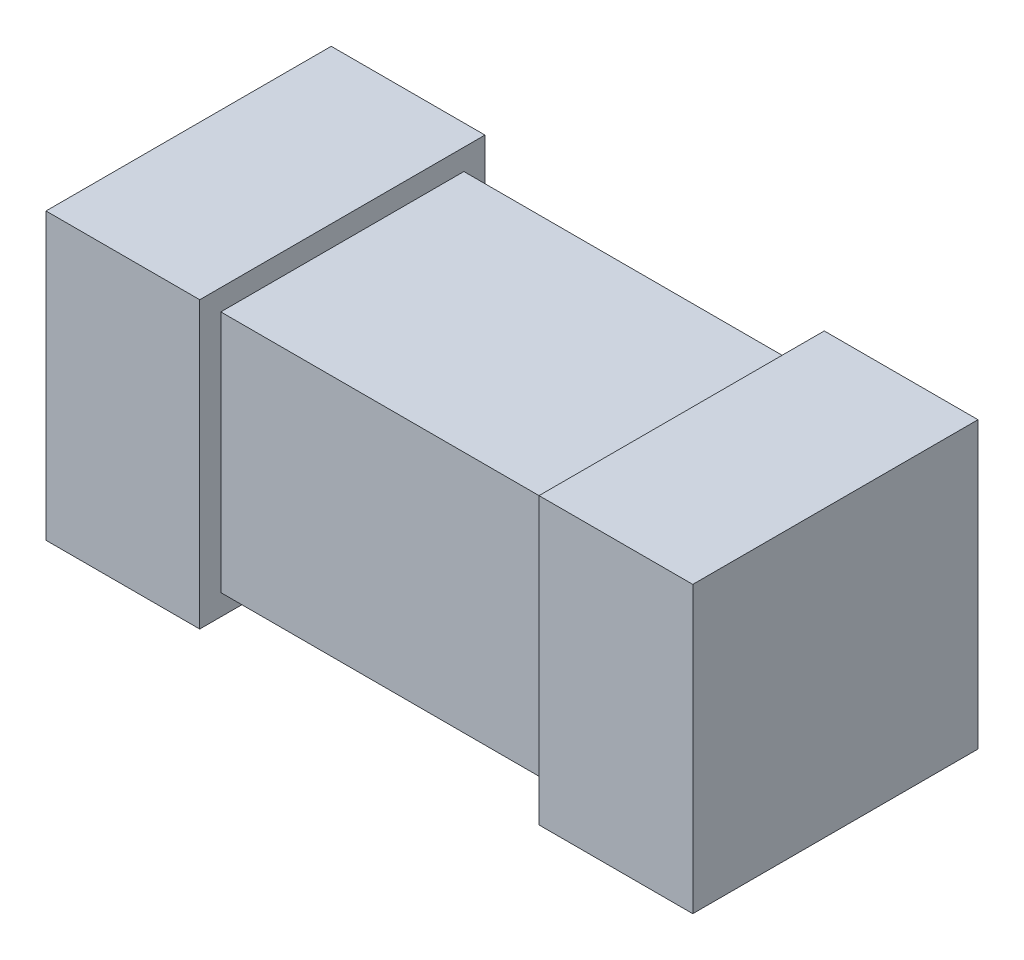
ISO-10303-21;
HEADER;
FILE_DESCRIPTION(('STEP AP214'),'2;1');
FILE_NAME('part.step','',(''),(''),'','','');
FILE_SCHEMA(('AUTOMOTIVE_DESIGN { 1 0 10303 214 1 1 1 1 }'));
ENDSEC;
DATA;
#1=APPLICATION_CONTEXT('core data for automotive mechanical design processes');
#2=APPLICATION_PROTOCOL_DEFINITION('international standard','automotive_design',2000,#1);
#3=PRODUCT_CONTEXT('',#1,'mechanical');
#4=PRODUCT('Part','Part','',(#3));
#5=PRODUCT_RELATED_PRODUCT_CATEGORY('part','',(#4));
#6=PRODUCT_DEFINITION_FORMATION('','',#4);
#7=PRODUCT_DEFINITION_CONTEXT('part definition',#1,'design');
#8=PRODUCT_DEFINITION('design','',#6,#7);
#9=PRODUCT_DEFINITION_SHAPE('','',#8);
#10=(LENGTH_UNIT() NAMED_UNIT(*) SI_UNIT(.MILLI.,.METRE.));
#11=(NAMED_UNIT(*) PLANE_ANGLE_UNIT() SI_UNIT($,.RADIAN.));
#12=(NAMED_UNIT(*) SI_UNIT($,.STERADIAN.) SOLID_ANGLE_UNIT());
#13=UNCERTAINTY_MEASURE_WITH_UNIT(LENGTH_MEASURE(1.E-05),#10,'distance_accuracy_value','');
#14=(GEOMETRIC_REPRESENTATION_CONTEXT(3) GLOBAL_UNCERTAINTY_ASSIGNED_CONTEXT((#13)) GLOBAL_UNIT_ASSIGNED_CONTEXT((#10,
#11,#12)) REPRESENTATION_CONTEXT('',''));
#15=CARTESIAN_POINT('',(0.,0.,0.));
#16=DIRECTION('',(0.,0.,1.));
#17=DIRECTION('',(1.,0.,0.));
#18=AXIS2_PLACEMENT_3D('',#15,#16,#17);
#19=CARTESIAN_POINT('',(1.6,-1.345,2.69));
#20=DIRECTION('',(1.,0.,0.));
#21=DIRECTION('',(0.,0.,-1.));
#22=AXIS2_PLACEMENT_3D('',#19,#20,#21);
#23=PLANE('',#22);
#24=DIRECTION('',(0.,-1.,0.));
#25=VECTOR('',#24,1.);
#26=CARTESIAN_POINT('',(1.6,-1.345,0.));
#27=LINE('',#26,#25);
#28=CARTESIAN_POINT('',(1.6,1.345,0.));
#29=VERTEX_POINT('',#28);
#30=CARTESIAN_POINT('',(1.6,-1.345,0.));
#31=VERTEX_POINT('',#30);
#32=EDGE_CURVE('E211',#29,#31,#27,.T.);
#33=ORIENTED_EDGE('',*,*,#32,.T.);
#34=DIRECTION('',(0.,0.,-1.));
#35=VECTOR('',#34,1.);
#36=CARTESIAN_POINT('',(1.6,-1.345,2.69));
#37=LINE('',#36,#35);
#38=CARTESIAN_POINT('',(1.6,-1.345,2.69));
#39=VERTEX_POINT('',#38);
#40=EDGE_CURVE('E216',#39,#31,#37,.T.);
#41=ORIENTED_EDGE('',*,*,#40,.F.);
#42=DIRECTION('',(0.,-1.,0.));
#43=VECTOR('',#42,1.);
#44=CARTESIAN_POINT('',(1.6,-1.345,2.69));
#45=LINE('',#44,#43);
#46=CARTESIAN_POINT('',(1.6,1.345,2.69));
#47=VERTEX_POINT('',#46);
#48=EDGE_CURVE('E202',#47,#39,#45,.T.);
#49=ORIENTED_EDGE('',*,*,#48,.F.);
#50=DIRECTION('',(0.,0.,-1.));
#51=VECTOR('',#50,1.);
#52=CARTESIAN_POINT('',(1.6,1.345,2.69));
#53=LINE('',#52,#51);
#54=EDGE_CURVE('E45',#47,#29,#53,.T.);
#55=ORIENTED_EDGE('',*,*,#54,.T.);
#56=EDGE_LOOP('',(#33,#41,#49,#55));
#57=FACE_BOUND('',#56,.T.);
#58=DIRECTION('',(0.,1.,0.));
#59=VECTOR('',#58,1.);
#60=CARTESIAN_POINT('',(1.6,-1.14630192607053,2.49130192607053));
#61=LINE('',#60,#59);
#62=CARTESIAN_POINT('',(1.6,-1.14630192607053,2.49130192607053));
#63=VERTEX_POINT('',#62);
#64=CARTESIAN_POINT('',(1.6,1.14630192607053,2.49130192607053));
#65=VERTEX_POINT('',#64);
#66=EDGE_CURVE('E52',#63,#65,#61,.T.);
#67=ORIENTED_EDGE('',*,*,#66,.F.);
#68=DIRECTION('',(0.,0.,1.));
#69=VECTOR('',#68,1.);
#70=CARTESIAN_POINT('',(1.6,-1.14630192607053,0.198698073929466));
#71=LINE('',#70,#69);
#72=CARTESIAN_POINT('',(1.6,-1.14630192607053,0.198698073929466));
#73=VERTEX_POINT('',#72);
#74=EDGE_CURVE('E57',#73,#63,#71,.T.);
#75=ORIENTED_EDGE('',*,*,#74,.F.);
#76=DIRECTION('',(0.,-1.,0.));
#77=VECTOR('',#76,1.);
#78=CARTESIAN_POINT('',(1.6,-1.14630192607053,0.198698073929466));
#79=LINE('',#78,#77);
#80=CARTESIAN_POINT('',(1.6,1.14630192607053,0.198698073929466));
#81=VERTEX_POINT('',#80);
#82=EDGE_CURVE('E188',#81,#73,#79,.T.);
#83=ORIENTED_EDGE('',*,*,#82,.F.);
#84=DIRECTION('',(0.,0.,-1.));
#85=VECTOR('',#84,1.);
#86=CARTESIAN_POINT('',(1.6,1.14630192607053,0.198698073929466));
#87=LINE('',#86,#85);
#88=EDGE_CURVE('E133',#65,#81,#87,.T.);
#89=ORIENTED_EDGE('',*,*,#88,.F.);
#90=EDGE_LOOP('',(#67,#75,#83,#89));
#91=FACE_BOUND('',#90,.T.);
#92=ADVANCED_FACE('F37',(#57,#91),#23,.F.);
#93=CARTESIAN_POINT('',(3.05,-1.345,2.69));
#94=DIRECTION('',(-1.,0.,0.));
#95=DIRECTION('',(0.,0.,1.));
#96=AXIS2_PLACEMENT_3D('',#93,#94,#95);
#97=PLANE('',#96);
#98=DIRECTION('',(0.,1.,0.));
#99=VECTOR('',#98,1.);
#100=CARTESIAN_POINT('',(3.05,-1.345,0.));
#101=LINE('',#100,#99);
#102=CARTESIAN_POINT('',(3.05,-1.345,0.));
#103=VERTEX_POINT('',#102);
#104=CARTESIAN_POINT('',(3.05,1.345,0.));
#105=VERTEX_POINT('',#104);
#106=EDGE_CURVE('E195',#103,#105,#101,.T.);
#107=ORIENTED_EDGE('',*,*,#106,.T.);
#108=DIRECTION('',(0.,0.,-1.));
#109=VECTOR('',#108,1.);
#110=CARTESIAN_POINT('',(3.05,1.345,2.69));
#111=LINE('',#110,#109);
#112=CARTESIAN_POINT('',(3.05,1.345,2.69));
#113=VERTEX_POINT('',#112);
#114=EDGE_CURVE('E11',#113,#105,#111,.T.);
#115=ORIENTED_EDGE('',*,*,#114,.F.);
#116=DIRECTION('',(0.,1.,0.));
#117=VECTOR('',#116,1.);
#118=CARTESIAN_POINT('',(3.05,-1.345,2.69));
#119=LINE('',#118,#117);
#120=CARTESIAN_POINT('',(3.05,-1.345,2.69));
#121=VERTEX_POINT('',#120);
#122=EDGE_CURVE('E196',#121,#113,#119,.T.);
#123=ORIENTED_EDGE('',*,*,#122,.F.);
#124=DIRECTION('',(0.,0.,-1.));
#125=VECTOR('',#124,1.);
#126=CARTESIAN_POINT('',(3.05,-1.345,2.69));
#127=LINE('',#126,#125);
#128=EDGE_CURVE('E206',#121,#103,#127,.T.);
#129=ORIENTED_EDGE('',*,*,#128,.T.);
#130=EDGE_LOOP('',(#107,#115,#123,#129));
#131=FACE_BOUND('',#130,.T.);
#132=ADVANCED_FACE('F39',(#131),#97,.F.);
#133=CARTESIAN_POINT('',(1.6,1.345,2.69));
#134=DIRECTION('',(0.,-1.,0.));
#135=DIRECTION('',(0.,0.,-1.));
#136=AXIS2_PLACEMENT_3D('',#133,#134,#135);
#137=PLANE('',#136);
#138=DIRECTION('',(-1.,0.,0.));
#139=VECTOR('',#138,1.);
#140=CARTESIAN_POINT('',(1.6,1.345,0.));
#141=LINE('',#140,#139);
#142=EDGE_CURVE('E209',#105,#29,#141,.T.);
#143=ORIENTED_EDGE('',*,*,#142,.T.);
#144=ORIENTED_EDGE('',*,*,#54,.F.);
#145=DIRECTION('',(-1.,0.,0.));
#146=VECTOR('',#145,1.);
#147=CARTESIAN_POINT('',(1.6,1.345,2.69));
#148=LINE('',#147,#146);
#149=EDGE_CURVE('E199',#113,#47,#148,.T.);
#150=ORIENTED_EDGE('',*,*,#149,.F.);
#151=ORIENTED_EDGE('',*,*,#114,.T.);
#152=EDGE_LOOP('',(#143,#144,#150,#151));
#153=FACE_BOUND('',#152,.T.);
#154=ADVANCED_FACE('F238',(#153),#137,.F.);
#155=CARTESIAN_POINT('',(1.6,-1.345,2.69));
#156=DIRECTION('',(0.,1.,0.));
#157=DIRECTION('',(0.,0.,1.));
#158=AXIS2_PLACEMENT_3D('',#155,#156,#157);
#159=PLANE('',#158);
#160=DIRECTION('',(1.,0.,0.));
#161=VECTOR('',#160,1.);
#162=CARTESIAN_POINT('',(1.6,-1.345,0.));
#163=LINE('',#162,#161);
#164=EDGE_CURVE('E200',#31,#103,#163,.T.);
#165=ORIENTED_EDGE('',*,*,#164,.T.);
#166=ORIENTED_EDGE('',*,*,#128,.F.);
#167=DIRECTION('',(1.,0.,0.));
#168=VECTOR('',#167,1.);
#169=CARTESIAN_POINT('',(1.6,-1.345,2.69));
#170=LINE('',#169,#168);
#171=EDGE_CURVE('E204',#39,#121,#170,.T.);
#172=ORIENTED_EDGE('',*,*,#171,.F.);
#173=ORIENTED_EDGE('',*,*,#40,.T.);
#174=EDGE_LOOP('',(#165,#166,#172,#173));
#175=FACE_BOUND('',#174,.T.);
#176=ADVANCED_FACE('F231',(#175),#159,.F.);
#177=CARTESIAN_POINT('',(0.,0.,2.69));
#178=DIRECTION('',(0.,0.,-1.));
#179=DIRECTION('',(-1.,0.,0.));
#180=AXIS2_PLACEMENT_3D('',#177,#178,#179);
#181=PLANE('',#180);
#182=ORIENTED_EDGE('',*,*,#122,.T.);
#183=ORIENTED_EDGE('',*,*,#149,.T.);
#184=ORIENTED_EDGE('',*,*,#48,.T.);
#185=ORIENTED_EDGE('',*,*,#171,.T.);
#186=EDGE_LOOP('',(#182,#183,#184,#185));
#187=FACE_BOUND('',#186,.T.);
#188=ADVANCED_FACE('F237',(#187),#181,.F.);
#189=CARTESIAN_POINT('',(0.,0.,0.));
#190=DIRECTION('',(0.,0.,-1.));
#191=DIRECTION('',(-1.,0.,0.));
#192=AXIS2_PLACEMENT_3D('',#189,#190,#191);
#193=PLANE('',#192);
#194=ORIENTED_EDGE('',*,*,#106,.F.);
#195=ORIENTED_EDGE('',*,*,#164,.F.);
#196=ORIENTED_EDGE('',*,*,#32,.F.);
#197=ORIENTED_EDGE('',*,*,#142,.F.);
#198=EDGE_LOOP('',(#194,#195,#196,#197));
#199=FACE_BOUND('',#198,.T.);
#200=ADVANCED_FACE('F228',(#199),#193,.T.);
#201=CARTESIAN_POINT('',(-3.2422314608467,-1.14630192607053,0.198698073929466));
#202=DIRECTION('',(0.,1.,0.));
#203=DIRECTION('',(0.,0.,1.));
#204=AXIS2_PLACEMENT_3D('',#201,#202,#203);
#205=PLANE('',#204);
#206=DIRECTION('',(1.,0.,0.));
#207=VECTOR('',#206,1.);
#208=CARTESIAN_POINT('',(-3.2422314608467,-1.14630192607053,2.49130192607053));
#209=LINE('',#208,#207);
#210=CARTESIAN_POINT('',(-1.6,-1.14630192607053,2.49130192607053));
#211=VERTEX_POINT('',#210);
#212=EDGE_CURVE('E191',#211,#63,#209,.T.);
#213=ORIENTED_EDGE('',*,*,#212,.F.);
#214=DIRECTION('',(0.,0.,1.));
#215=VECTOR('',#214,1.);
#216=CARTESIAN_POINT('',(-1.6,-1.14630192607053,0.198698073929466));
#217=LINE('',#216,#215);
#218=CARTESIAN_POINT('',(-1.6,-1.14630192607053,0.198698073929466));
#219=VERTEX_POINT('',#218);
#220=EDGE_CURVE('E145',#219,#211,#217,.T.);
#221=ORIENTED_EDGE('',*,*,#220,.F.);
#222=DIRECTION('',(1.,0.,0.));
#223=VECTOR('',#222,1.);
#224=CARTESIAN_POINT('',(-3.2422314608467,-1.14630192607053,0.198698073929466));
#225=LINE('',#224,#223);
#226=EDGE_CURVE('E137',#219,#73,#225,.T.);
#227=ORIENTED_EDGE('',*,*,#226,.T.);
#228=ORIENTED_EDGE('',*,*,#74,.T.);
#229=EDGE_LOOP('',(#213,#221,#227,#228));
#230=FACE_BOUND('',#229,.T.);
#231=ADVANCED_FACE('F252',(#230),#205,.F.);
#232=CARTESIAN_POINT('',(-3.2422314608467,-1.14630192607053,0.198698073929466));
#233=DIRECTION('',(0.,0.,1.));
#234=DIRECTION('',(1.,0.,0.));
#235=AXIS2_PLACEMENT_3D('',#232,#233,#234);
#236=PLANE('',#235);
#237=ORIENTED_EDGE('',*,*,#226,.F.);
#238=DIRECTION('',(0.,-1.,0.));
#239=VECTOR('',#238,1.);
#240=CARTESIAN_POINT('',(-1.6,-1.14630192607053,0.198698073929466));
#241=LINE('',#240,#239);
#242=CARTESIAN_POINT('',(-1.6,1.14630192607053,0.198698073929466));
#243=VERTEX_POINT('',#242);
#244=EDGE_CURVE('E140',#243,#219,#241,.T.);
#245=ORIENTED_EDGE('',*,*,#244,.F.);
#246=DIRECTION('',(1.,0.,0.));
#247=VECTOR('',#246,1.);
#248=CARTESIAN_POINT('',(-3.2422314608467,1.14630192607053,0.198698073929466));
#249=LINE('',#248,#247);
#250=EDGE_CURVE('E126',#243,#81,#249,.T.);
#251=ORIENTED_EDGE('',*,*,#250,.T.);
#252=ORIENTED_EDGE('',*,*,#82,.T.);
#253=EDGE_LOOP('',(#237,#245,#251,#252));
#254=FACE_BOUND('',#253,.T.);
#255=ADVANCED_FACE('F141',(#254),#236,.F.);
#256=CARTESIAN_POINT('',(-3.2422314608467,1.14630192607053,0.198698073929466));
#257=DIRECTION('',(0.,-1.,0.));
#258=DIRECTION('',(0.,0.,-1.));
#259=AXIS2_PLACEMENT_3D('',#256,#257,#258);
#260=PLANE('',#259);
#261=ORIENTED_EDGE('',*,*,#250,.F.);
#262=DIRECTION('',(0.,0.,-1.));
#263=VECTOR('',#262,1.);
#264=CARTESIAN_POINT('',(-1.6,1.14630192607053,0.198698073929466));
#265=LINE('',#264,#263);
#266=CARTESIAN_POINT('',(-1.6,1.14630192607053,2.49130192607053));
#267=VERTEX_POINT('',#266);
#268=EDGE_CURVE('E131',#267,#243,#265,.T.);
#269=ORIENTED_EDGE('',*,*,#268,.F.);
#270=DIRECTION('',(1.,0.,0.));
#271=VECTOR('',#270,1.);
#272=CARTESIAN_POINT('',(-3.2422314608467,1.14630192607053,2.49130192607053));
#273=LINE('',#272,#271);
#274=EDGE_CURVE('E136',#267,#65,#273,.T.);
#275=ORIENTED_EDGE('',*,*,#274,.T.);
#276=ORIENTED_EDGE('',*,*,#88,.T.);
#277=EDGE_LOOP('',(#261,#269,#275,#276));
#278=FACE_BOUND('',#277,.T.);
#279=ADVANCED_FACE('F128',(#278),#260,.F.);
#280=CARTESIAN_POINT('',(-3.2422314608467,-1.14630192607053,2.49130192607053));
#281=DIRECTION('',(0.,0.,-1.));
#282=DIRECTION('',(-1.,0.,0.));
#283=AXIS2_PLACEMENT_3D('',#280,#281,#282);
#284=PLANE('',#283);
#285=ORIENTED_EDGE('',*,*,#274,.F.);
#286=DIRECTION('',(0.,1.,0.));
#287=VECTOR('',#286,1.);
#288=CARTESIAN_POINT('',(-1.6,-1.14630192607053,2.49130192607053));
#289=LINE('',#288,#287);
#290=EDGE_CURVE('E149',#211,#267,#289,.T.);
#291=ORIENTED_EDGE('',*,*,#290,.F.);
#292=ORIENTED_EDGE('',*,*,#212,.T.);
#293=ORIENTED_EDGE('',*,*,#66,.T.);
#294=EDGE_LOOP('',(#285,#291,#292,#293));
#295=FACE_BOUND('',#294,.T.);
#296=ADVANCED_FACE('F255',(#295),#284,.F.);
#297=CARTESIAN_POINT('',(-1.6,-1.345,2.69));
#298=DIRECTION('',(-1.,0.,0.));
#299=DIRECTION('',(0.,0.,-1.));
#300=AXIS2_PLACEMENT_3D('',#297,#298,#299);
#301=PLANE('',#300);
#302=DIRECTION('',(0.,-1.,0.));
#303=VECTOR('',#302,1.);
#304=CARTESIAN_POINT('',(-1.6,-1.345,0.));
#305=LINE('',#304,#303);
#306=CARTESIAN_POINT('',(-1.6,1.345,0.));
#307=VERTEX_POINT('',#306);
#308=CARTESIAN_POINT('',(-1.6,-1.345,0.));
#309=VERTEX_POINT('',#308);
#310=EDGE_CURVE('E171',#307,#309,#305,.T.);
#311=ORIENTED_EDGE('',*,*,#310,.F.);
#312=DIRECTION('',(0.,0.,-1.));
#313=VECTOR('',#312,1.);
#314=CARTESIAN_POINT('',(-1.6,1.345,2.69));
#315=LINE('',#314,#313);
#316=CARTESIAN_POINT('',(-1.6,1.345,2.69));
#317=VERTEX_POINT('',#316);
#318=EDGE_CURVE('E180',#317,#307,#315,.T.);
#319=ORIENTED_EDGE('',*,*,#318,.F.);
#320=DIRECTION('',(0.,-1.,0.));
#321=VECTOR('',#320,1.);
#322=CARTESIAN_POINT('',(-1.6,-1.345,2.69));
#323=LINE('',#322,#321);
#324=CARTESIAN_POINT('',(-1.6,-1.345,2.69));
#325=VERTEX_POINT('',#324);
#326=EDGE_CURVE('E161',#317,#325,#323,.T.);
#327=ORIENTED_EDGE('',*,*,#326,.T.);
#328=DIRECTION('',(0.,0.,-1.));
#329=VECTOR('',#328,1.);
#330=CARTESIAN_POINT('',(-1.6,-1.345,2.69));
#331=LINE('',#330,#329);
#332=EDGE_CURVE('E177',#325,#309,#331,.T.);
#333=ORIENTED_EDGE('',*,*,#332,.T.);
#334=EDGE_LOOP('',(#311,#319,#327,#333));
#335=FACE_BOUND('',#334,.T.);
#336=ORIENTED_EDGE('',*,*,#290,.T.);
#337=ORIENTED_EDGE('',*,*,#268,.T.);
#338=ORIENTED_EDGE('',*,*,#244,.T.);
#339=ORIENTED_EDGE('',*,*,#220,.T.);
#340=EDGE_LOOP('',(#336,#337,#338,#339));
#341=FACE_BOUND('',#340,.T.);
#342=ADVANCED_FACE('F147',(#335,#341),#301,.F.);
#343=CARTESIAN_POINT('',(-3.05,-1.345,2.69));
#344=DIRECTION('',(1.,0.,0.));
#345=DIRECTION('',(0.,0.,1.));
#346=AXIS2_PLACEMENT_3D('',#343,#344,#345);
#347=PLANE('',#346);
#348=DIRECTION('',(0.,1.,0.));
#349=VECTOR('',#348,1.);
#350=CARTESIAN_POINT('',(-3.05,-1.345,0.));
#351=LINE('',#350,#349);
#352=CARTESIAN_POINT('',(-3.05,-1.345,0.));
#353=VERTEX_POINT('',#352);
#354=CARTESIAN_POINT('',(-3.05,1.345,0.));
#355=VERTEX_POINT('',#354);
#356=EDGE_CURVE('E154',#353,#355,#351,.T.);
#357=ORIENTED_EDGE('',*,*,#356,.F.);
#358=DIRECTION('',(0.,0.,-1.));
#359=VECTOR('',#358,1.);
#360=CARTESIAN_POINT('',(-3.05,-1.345,2.69));
#361=LINE('',#360,#359);
#362=CARTESIAN_POINT('',(-3.05,-1.345,2.69));
#363=VERTEX_POINT('',#362);
#364=EDGE_CURVE('E166',#363,#353,#361,.T.);
#365=ORIENTED_EDGE('',*,*,#364,.F.);
#366=DIRECTION('',(0.,1.,0.));
#367=VECTOR('',#366,1.);
#368=CARTESIAN_POINT('',(-3.05,-1.345,2.69));
#369=LINE('',#368,#367);
#370=CARTESIAN_POINT('',(-3.05,1.345,2.69));
#371=VERTEX_POINT('',#370);
#372=EDGE_CURVE('E155',#363,#371,#369,.T.);
#373=ORIENTED_EDGE('',*,*,#372,.T.);
#374=DIRECTION('',(0.,0.,-1.));
#375=VECTOR('',#374,1.);
#376=CARTESIAN_POINT('',(-3.05,1.345,2.69));
#377=LINE('',#376,#375);
#378=EDGE_CURVE('E183',#371,#355,#377,.T.);
#379=ORIENTED_EDGE('',*,*,#378,.T.);
#380=EDGE_LOOP('',(#357,#365,#373,#379));
#381=FACE_BOUND('',#380,.T.);
#382=ADVANCED_FACE('F266',(#381),#347,.F.);
#383=CARTESIAN_POINT('',(-1.6,1.345,2.69));
#384=DIRECTION('',(0.,-1.,0.));
#385=DIRECTION('',(0.,0.,-1.));
#386=AXIS2_PLACEMENT_3D('',#383,#384,#385);
#387=PLANE('',#386);
#388=DIRECTION('',(1.,0.,0.));
#389=VECTOR('',#388,1.);
#390=CARTESIAN_POINT('',(-1.6,1.345,0.));
#391=LINE('',#390,#389);
#392=EDGE_CURVE('E169',#355,#307,#391,.T.);
#393=ORIENTED_EDGE('',*,*,#392,.F.);
#394=ORIENTED_EDGE('',*,*,#378,.F.);
#395=DIRECTION('',(1.,0.,0.));
#396=VECTOR('',#395,1.);
#397=CARTESIAN_POINT('',(-1.6,1.345,2.69));
#398=LINE('',#397,#396);
#399=EDGE_CURVE('E158',#371,#317,#398,.T.);
#400=ORIENTED_EDGE('',*,*,#399,.T.);
#401=ORIENTED_EDGE('',*,*,#318,.T.);
#402=EDGE_LOOP('',(#393,#394,#400,#401));
#403=FACE_BOUND('',#402,.T.);
#404=ADVANCED_FACE('F269',(#403),#387,.F.);
#405=CARTESIAN_POINT('',(-1.6,-1.345,2.69));
#406=DIRECTION('',(0.,1.,0.));
#407=DIRECTION('',(0.,0.,1.));
#408=AXIS2_PLACEMENT_3D('',#405,#406,#407);
#409=PLANE('',#408);
#410=DIRECTION('',(-1.,0.,0.));
#411=VECTOR('',#410,1.);
#412=CARTESIAN_POINT('',(-1.6,-1.345,0.));
#413=LINE('',#412,#411);
#414=EDGE_CURVE('E159',#309,#353,#413,.T.);
#415=ORIENTED_EDGE('',*,*,#414,.F.);
#416=ORIENTED_EDGE('',*,*,#332,.F.);
#417=DIRECTION('',(-1.,0.,0.));
#418=VECTOR('',#417,1.);
#419=CARTESIAN_POINT('',(-1.6,-1.345,2.69));
#420=LINE('',#419,#418);
#421=EDGE_CURVE('E164',#325,#363,#420,.T.);
#422=ORIENTED_EDGE('',*,*,#421,.T.);
#423=ORIENTED_EDGE('',*,*,#364,.T.);
#424=EDGE_LOOP('',(#415,#416,#422,#423));
#425=FACE_BOUND('',#424,.T.);
#426=ADVANCED_FACE('F273',(#425),#409,.F.);
#427=CARTESIAN_POINT('',(0.,0.,2.69));
#428=DIRECTION('',(0.,0.,-1.));
#429=DIRECTION('',(1.,0.,0.));
#430=AXIS2_PLACEMENT_3D('',#427,#428,#429);
#431=PLANE('',#430);
#432=ORIENTED_EDGE('',*,*,#372,.F.);
#433=ORIENTED_EDGE('',*,*,#421,.F.);
#434=ORIENTED_EDGE('',*,*,#326,.F.);
#435=ORIENTED_EDGE('',*,*,#399,.F.);
#436=EDGE_LOOP('',(#432,#433,#434,#435));
#437=FACE_BOUND('',#436,.T.);
#438=ADVANCED_FACE('F280',(#437),#431,.F.);
#439=CARTESIAN_POINT('',(0.,0.,0.));
#440=DIRECTION('',(0.,0.,-1.));
#441=DIRECTION('',(1.,0.,0.));
#442=AXIS2_PLACEMENT_3D('',#439,#440,#441);
#443=PLANE('',#442);
#444=ORIENTED_EDGE('',*,*,#356,.T.);
#445=ORIENTED_EDGE('',*,*,#392,.T.);
#446=ORIENTED_EDGE('',*,*,#310,.T.);
#447=ORIENTED_EDGE('',*,*,#414,.T.);
#448=EDGE_LOOP('',(#444,#445,#446,#447));
#449=FACE_BOUND('',#448,.T.);
#450=ADVANCED_FACE('F282',(#449),#443,.T.);
#451=CLOSED_SHELL('',(#92,#132,#154,#176,#188,#200,#231,#255,#279,#296,#342,#382,#404,#426,#438,#450));
#452=MANIFOLD_SOLID_BREP('B2',#451);
#453=ADVANCED_BREP_SHAPE_REPRESENTATION('',(#18,#452),#14);
#454=SHAPE_DEFINITION_REPRESENTATION(#9,#453);
ENDSEC;
END-ISO-10303-21;
